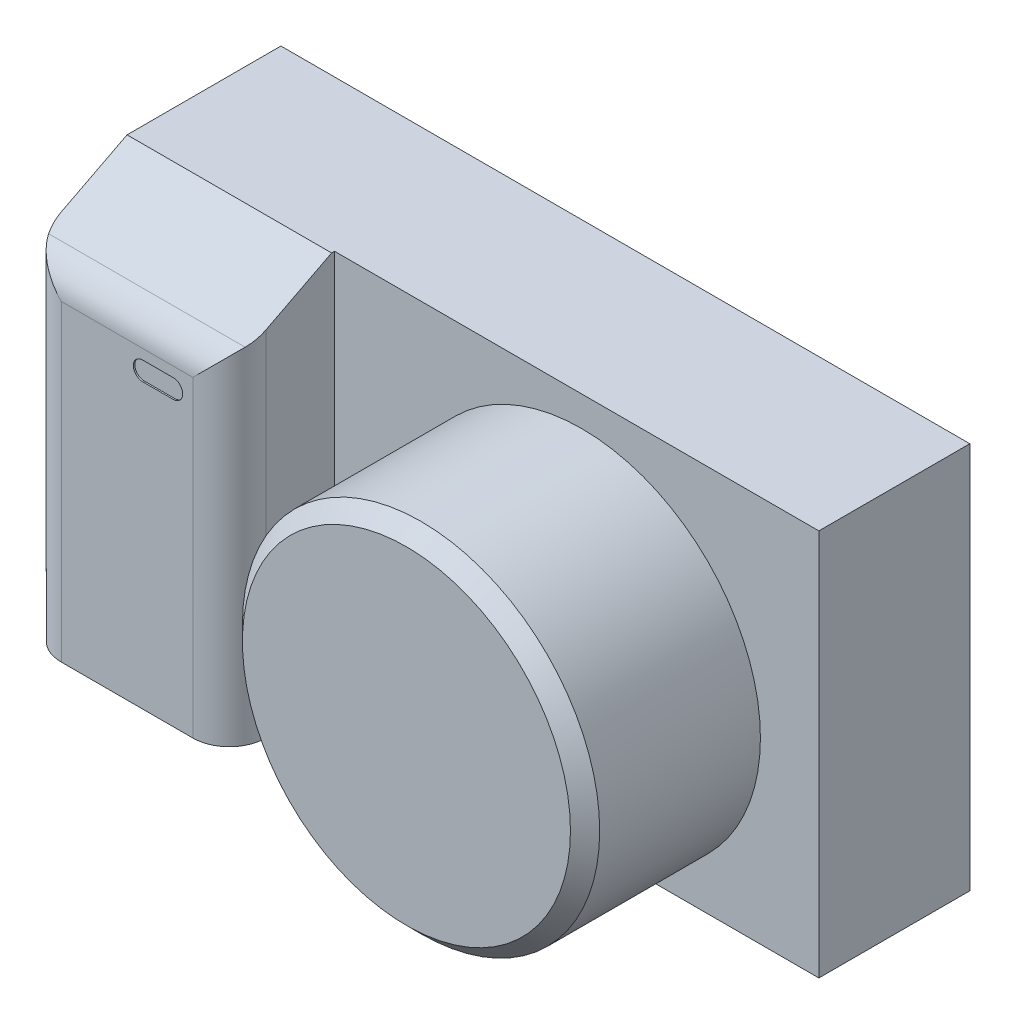
ISO-10303-21;
HEADER;
FILE_DESCRIPTION(('STEP AP214'),'2;1');
FILE_NAME('part.step','',(''),(''),'','','');
FILE_SCHEMA(('AUTOMOTIVE_DESIGN { 1 0 10303 214 1 1 1 1 }'));
ENDSEC;
DATA;
#1=APPLICATION_CONTEXT('core data for automotive mechanical design processes');
#2=APPLICATION_PROTOCOL_DEFINITION('international standard','automotive_design',2000,#1);
#3=PRODUCT_CONTEXT('',#1,'mechanical');
#4=PRODUCT('Part','Part','',(#3));
#5=PRODUCT_RELATED_PRODUCT_CATEGORY('part','',(#4));
#6=PRODUCT_DEFINITION_FORMATION('','',#4);
#7=PRODUCT_DEFINITION_CONTEXT('part definition',#1,'design');
#8=PRODUCT_DEFINITION('design','',#6,#7);
#9=PRODUCT_DEFINITION_SHAPE('','',#8);
#10=(LENGTH_UNIT() NAMED_UNIT(*) SI_UNIT(.MILLI.,.METRE.));
#11=(NAMED_UNIT(*) PLANE_ANGLE_UNIT() SI_UNIT($,.RADIAN.));
#12=(NAMED_UNIT(*) SI_UNIT($,.STERADIAN.) SOLID_ANGLE_UNIT());
#13=UNCERTAINTY_MEASURE_WITH_UNIT(LENGTH_MEASURE(1.E-05),#10,'distance_accuracy_value','');
#14=(GEOMETRIC_REPRESENTATION_CONTEXT(3) GLOBAL_UNCERTAINTY_ASSIGNED_CONTEXT((#13)) GLOBAL_UNIT_ASSIGNED_CONTEXT((#10,
#11,#12)) REPRESENTATION_CONTEXT('',''));
#15=CARTESIAN_POINT('',(0.,0.,0.));
#16=DIRECTION('',(0.,0.,1.));
#17=DIRECTION('',(1.,0.,0.));
#18=AXIS2_PLACEMENT_3D('',#15,#16,#17);
#19=CARTESIAN_POINT('',(0.,0.,26.2382));
#20=DIRECTION('',(0.,0.,-1.));
#21=DIRECTION('',(-1.,0.,0.));
#22=AXIS2_PLACEMENT_3D('',#19,#20,#21);
#23=PLANE('',#22);
#24=DIRECTION('',(0.,1.,0.));
#25=VECTOR('',#24,1.);
#26=CARTESIAN_POINT('',(-24.31415,33.655,26.2382));
#27=LINE('',#26,#25);
#28=CARTESIAN_POINT('',(-24.31415,-33.655,26.2382));
#29=VERTEX_POINT('',#28);
#30=CARTESIAN_POINT('',(-24.31415,33.655,26.2382));
#31=VERTEX_POINT('',#30);
#32=EDGE_CURVE('E195',#29,#31,#27,.T.);
#33=ORIENTED_EDGE('',*,*,#32,.F.);
#34=DIRECTION('',(1.,0.,0.));
#35=VECTOR('',#34,1.);
#36=CARTESIAN_POINT('',(-59.87415,-33.655,26.2382));
#37=LINE('',#36,#35);
#38=CARTESIAN_POINT('',(18.66265,-33.655,26.2382));
#39=VERTEX_POINT('',#38);
#40=EDGE_CURVE('E213',#29,#39,#37,.T.);
#41=ORIENTED_EDGE('',*,*,#40,.T.);
#42=CARTESIAN_POINT('',(18.66265,-2.6035,26.2382));
#43=DIRECTION('',(0.,0.,1.));
#44=DIRECTION('',(1.,0.,0.));
#45=AXIS2_PLACEMENT_3D('',#42,#43,#44);
#46=CIRCLE('',#45,31.0515);
#47=EDGE_CURVE('E201',#39,#39,#46,.T.);
#48=ORIENTED_EDGE('',*,*,#47,.F.);
#49=CARTESIAN_POINT('',(59.87415,-33.655,26.2382));
#50=VERTEX_POINT('',#49);
#51=EDGE_CURVE('E212',#39,#50,#37,.T.);
#52=ORIENTED_EDGE('',*,*,#51,.T.);
#53=DIRECTION('',(0.,1.,0.));
#54=VECTOR('',#53,1.);
#55=CARTESIAN_POINT('',(59.87415,-33.655,26.2382));
#56=LINE('',#55,#54);
#57=CARTESIAN_POINT('',(59.87415,33.655,26.2382));
#58=VERTEX_POINT('',#57);
#59=EDGE_CURVE('E205',#50,#58,#56,.T.);
#60=ORIENTED_EDGE('',*,*,#59,.T.);
#61=DIRECTION('',(-1.,0.,0.));
#62=VECTOR('',#61,1.);
#63=CARTESIAN_POINT('',(-59.87415,33.655,26.2382));
#64=LINE('',#63,#62);
#65=EDGE_CURVE('E208',#58,#31,#64,.T.);
#66=ORIENTED_EDGE('',*,*,#65,.T.);
#67=EDGE_LOOP('',(#33,#41,#48,#52,#60,#66));
#68=FACE_BOUND('',#67,.T.);
#69=ADVANCED_FACE('F39',(#68),#23,.F.);
#70=CARTESIAN_POINT('',(59.87415,-33.655,26.2382));
#71=DIRECTION('',(-1.,0.,0.));
#72=DIRECTION('',(0.,0.,1.));
#73=AXIS2_PLACEMENT_3D('',#70,#71,#72);
#74=PLANE('',#73);
#75=DIRECTION('',(0.,1.,0.));
#76=VECTOR('',#75,1.);
#77=CARTESIAN_POINT('',(59.87415,-33.655,0.));
#78=LINE('',#77,#76);
#79=CARTESIAN_POINT('',(59.87415,-33.655,0.));
#80=VERTEX_POINT('',#79);
#81=CARTESIAN_POINT('',(59.87415,33.655,0.));
#82=VERTEX_POINT('',#81);
#83=EDGE_CURVE('E204',#80,#82,#78,.T.);
#84=ORIENTED_EDGE('',*,*,#83,.T.);
#85=DIRECTION('',(0.,0.,-1.));
#86=VECTOR('',#85,1.);
#87=CARTESIAN_POINT('',(59.87415,33.655,26.2382));
#88=LINE('',#87,#86);
#89=EDGE_CURVE('E231',#58,#82,#88,.T.);
#90=ORIENTED_EDGE('',*,*,#89,.F.);
#91=ORIENTED_EDGE('',*,*,#59,.F.);
#92=DIRECTION('',(0.,0.,-1.));
#93=VECTOR('',#92,1.);
#94=CARTESIAN_POINT('',(59.87415,-33.655,26.2382));
#95=LINE('',#94,#93);
#96=EDGE_CURVE('E215',#50,#80,#95,.T.);
#97=ORIENTED_EDGE('',*,*,#96,.T.);
#98=EDGE_LOOP('',(#84,#90,#91,#97));
#99=FACE_BOUND('',#98,.T.);
#100=ADVANCED_FACE('F295',(#99),#74,.F.);
#101=CARTESIAN_POINT('',(-59.87415,33.655,26.2382));
#102=DIRECTION('',(0.,-1.,0.));
#103=DIRECTION('',(0.,0.,-1.));
#104=AXIS2_PLACEMENT_3D('',#101,#102,#103);
#105=PLANE('',#104);
#106=DIRECTION('',(0.,0.,-1.));
#107=VECTOR('',#106,1.);
#108=CARTESIAN_POINT('',(-59.87415,33.655,26.2382));
#109=LINE('',#108,#107);
#110=CARTESIAN_POINT('',(-59.87415,33.655,26.7461999999999));
#111=VERTEX_POINT('',#110);
#112=CARTESIAN_POINT('',(-59.87415,33.655,0.));
#113=VERTEX_POINT('',#112);
#114=EDGE_CURVE('E229',#111,#113,#109,.T.);
#115=ORIENTED_EDGE('',*,*,#114,.F.);
#116=DIRECTION('',(1.,0.,0.));
#117=VECTOR('',#116,1.);
#118=CARTESIAN_POINT('',(-24.31415,33.655,26.7461999999999));
#119=LINE('',#118,#117);
#120=CARTESIAN_POINT('',(-24.31415,33.655,26.7461999999999));
#121=VERTEX_POINT('',#120);
#122=EDGE_CURVE('E242',#111,#121,#119,.T.);
#123=ORIENTED_EDGE('',*,*,#122,.T.);
#124=DIRECTION('',(0.,0.,-1.));
#125=VECTOR('',#124,1.);
#126=CARTESIAN_POINT('',(-24.31415,33.655,44.5262));
#127=LINE('',#126,#125);
#128=EDGE_CURVE('E194',#121,#31,#127,.T.);
#129=ORIENTED_EDGE('',*,*,#128,.T.);
#130=ORIENTED_EDGE('',*,*,#65,.F.);
#131=ORIENTED_EDGE('',*,*,#89,.T.);
#132=DIRECTION('',(-1.,0.,0.));
#133=VECTOR('',#132,1.);
#134=CARTESIAN_POINT('',(-59.87415,33.655,0.));
#135=LINE('',#134,#133);
#136=EDGE_CURVE('E218',#82,#113,#135,.T.);
#137=ORIENTED_EDGE('',*,*,#136,.T.);
#138=EDGE_LOOP('',(#115,#123,#129,#130,#131,#137));
#139=FACE_BOUND('',#138,.T.);
#140=ADVANCED_FACE('F287',(#139),#105,.F.);
#141=CARTESIAN_POINT('',(-59.87415,-33.655,26.2382));
#142=DIRECTION('',(1.,0.,0.));
#143=DIRECTION('',(0.,0.,-1.));
#144=AXIS2_PLACEMENT_3D('',#141,#142,#143);
#145=PLANE('',#144);
#146=DIRECTION('',(0.,0.,-1.));
#147=VECTOR('',#146,1.);
#148=CARTESIAN_POINT('',(-59.87415,-33.655,26.2382));
#149=LINE('',#148,#147);
#150=CARTESIAN_POINT('',(-59.87415,-33.655,38.1762));
#151=VERTEX_POINT('',#150);
#152=CARTESIAN_POINT('',(-59.87415,-33.655,0.));
#153=VERTEX_POINT('',#152);
#154=EDGE_CURVE('E227',#151,#153,#149,.T.);
#155=ORIENTED_EDGE('',*,*,#154,.F.);
#156=DIRECTION('',(0.,-1.,0.));
#157=VECTOR('',#156,1.);
#158=CARTESIAN_POINT('',(-59.87415,24.511,38.1762));
#159=LINE('',#158,#157);
#160=CARTESIAN_POINT('',(-59.87415,27.7767142857143,38.1762));
#161=VERTEX_POINT('',#160);
#162=EDGE_CURVE('E11',#151,#161,#159,.F.);
#163=ORIENTED_EDGE('',*,*,#162,.T.);
#164=DIRECTION('',(0.,0.45734801262076,-0.889287802318148));
#165=VECTOR('',#164,1.);
#166=CARTESIAN_POINT('',(-59.87415,24.511,44.5262));
#167=LINE('',#166,#165);
#168=EDGE_CURVE('E240',#161,#111,#167,.T.);
#169=ORIENTED_EDGE('',*,*,#168,.T.);
#170=ORIENTED_EDGE('',*,*,#114,.T.);
#171=DIRECTION('',(0.,-1.,0.));
#172=VECTOR('',#171,1.);
#173=CARTESIAN_POINT('',(-59.87415,-33.655,0.));
#174=LINE('',#173,#172);
#175=EDGE_CURVE('E221',#113,#153,#174,.T.);
#176=ORIENTED_EDGE('',*,*,#175,.T.);
#177=EDGE_LOOP('',(#155,#163,#169,#170,#176));
#178=FACE_BOUND('',#177,.T.);
#179=ADVANCED_FACE('F302',(#178),#145,.F.);
#180=CARTESIAN_POINT('',(-59.87415,-33.655,26.2382));
#181=DIRECTION('',(0.,1.,0.));
#182=DIRECTION('',(0.,0.,1.));
#183=AXIS2_PLACEMENT_3D('',#180,#181,#182);
#184=PLANE('',#183);
#185=CARTESIAN_POINT('',(19.74215,-33.655,13.462));
#186=DIRECTION('',(0.,-1.,0.));
#187=DIRECTION('',(0.,0.,-1.));
#188=AXIS2_PLACEMENT_3D('',#185,#186,#187);
#189=CIRCLE('',#188,2.5527);
#190=CARTESIAN_POINT('',(19.74215,-33.655,10.9093));
#191=VERTEX_POINT('',#190);
#192=EDGE_CURVE('E156',#191,#191,#189,.T.);
#193=ORIENTED_EDGE('',*,*,#192,.F.);
#194=EDGE_LOOP('',(#193));
#195=FACE_BOUND('',#194,.T.);
#196=DIRECTION('',(0.,0.,-1.));
#197=VECTOR('',#196,1.);
#198=CARTESIAN_POINT('',(-24.31415,-33.655,44.5262));
#199=LINE('',#198,#197);
#200=CARTESIAN_POINT('',(-24.31415,-33.655,38.1762));
#201=VERTEX_POINT('',#200);
#202=EDGE_CURVE('E199',#201,#29,#199,.T.);
#203=ORIENTED_EDGE('',*,*,#202,.F.);
#204=CARTESIAN_POINT('',(-30.66415,-33.655,38.1762));
#205=DIRECTION('',(0.,1.,0.));
#206=DIRECTION('',(0.,0.,1.));
#207=AXIS2_PLACEMENT_3D('',#204,#205,#206);
#208=CIRCLE('',#207,6.35);
#209=CARTESIAN_POINT('',(-30.66415,-33.655,44.5262));
#210=VERTEX_POINT('',#209);
#211=EDGE_CURVE('E48',#201,#210,#208,.F.);
#212=ORIENTED_EDGE('',*,*,#211,.T.);
#213=DIRECTION('',(1.,0.,0.));
#214=VECTOR('',#213,1.);
#215=CARTESIAN_POINT('',(-59.87415,-33.655,44.5262));
#216=LINE('',#215,#214);
#217=CARTESIAN_POINT('',(-53.52415,-33.655,44.5262));
#218=VERTEX_POINT('',#217);
#219=EDGE_CURVE('E191',#218,#210,#216,.T.);
#220=ORIENTED_EDGE('',*,*,#219,.F.);
#221=CARTESIAN_POINT('',(-53.52415,-33.655,38.1762));
#222=DIRECTION('',(0.,1.,0.));
#223=DIRECTION('',(0.,0.,1.));
#224=AXIS2_PLACEMENT_3D('',#221,#222,#223);
#225=CIRCLE('',#224,6.35);
#226=EDGE_CURVE('E64',#218,#151,#225,.F.);
#227=ORIENTED_EDGE('',*,*,#226,.T.);
#228=ORIENTED_EDGE('',*,*,#154,.T.);
#229=DIRECTION('',(1.,0.,0.));
#230=VECTOR('',#229,1.);
#231=CARTESIAN_POINT('',(-59.87415,-33.655,0.));
#232=LINE('',#231,#230);
#233=EDGE_CURVE('E209',#153,#80,#232,.T.);
#234=ORIENTED_EDGE('',*,*,#233,.T.);
#235=ORIENTED_EDGE('',*,*,#96,.F.);
#236=ORIENTED_EDGE('',*,*,#51,.F.);
#237=ORIENTED_EDGE('',*,*,#40,.F.);
#238=EDGE_LOOP('',(#203,#212,#220,#227,#228,#234,#235,#236,#237));
#239=FACE_BOUND('',#238,.T.);
#240=ADVANCED_FACE('F310',(#195,#239),#184,.F.);
#241=CARTESIAN_POINT('',(0.,0.,0.));
#242=DIRECTION('',(0.,0.,-1.));
#243=DIRECTION('',(-1.,0.,0.));
#244=AXIS2_PLACEMENT_3D('',#241,#242,#243);
#245=PLANE('',#244);
#246=ORIENTED_EDGE('',*,*,#83,.F.);
#247=ORIENTED_EDGE('',*,*,#233,.F.);
#248=ORIENTED_EDGE('',*,*,#175,.F.);
#249=ORIENTED_EDGE('',*,*,#136,.F.);
#250=EDGE_LOOP('',(#246,#247,#248,#249));
#251=FACE_BOUND('',#250,.T.);
#252=ADVANCED_FACE('F300',(#251),#245,.T.);
#253=CARTESIAN_POINT('',(18.66265,-2.6035,56.7182));
#254=DIRECTION('',(0.,0.,-1.));
#255=DIRECTION('',(-1.,0.,0.));
#256=AXIS2_PLACEMENT_3D('',#253,#254,#255);
#257=CYLINDRICAL_SURFACE('',#256,31.0515);
#258=CARTESIAN_POINT('',(18.66265,-2.6035,54.1782));
#259=DIRECTION('',(0.,0.,1.));
#260=DIRECTION('',(1.,0.,0.));
#261=AXIS2_PLACEMENT_3D('',#258,#259,#260);
#262=CIRCLE('',#261,31.0515);
#263=CARTESIAN_POINT('',(49.71415,-2.6035,54.1782));
#264=VERTEX_POINT('',#263);
#265=EDGE_CURVE('E237',#264,#264,#262,.F.);
#266=ORIENTED_EDGE('',*,*,#265,.T.);
#267=EDGE_LOOP('',(#266));
#268=FACE_BOUND('',#267,.T.);
#269=ORIENTED_EDGE('',*,*,#47,.T.);
#270=EDGE_LOOP('',(#269));
#271=FACE_BOUND('',#270,.T.);
#272=ADVANCED_FACE('F313',(#268,#271),#257,.T.);
#273=CARTESIAN_POINT('',(18.66265,-2.6035,56.7182));
#274=DIRECTION('',(0.,0.,1.));
#275=DIRECTION('',(1.,0.,0.));
#276=AXIS2_PLACEMENT_3D('',#273,#274,#275);
#277=PLANE('',#276);
#278=CARTESIAN_POINT('',(18.66265,-2.6035,56.7182));
#279=DIRECTION('',(0.,0.,1.));
#280=DIRECTION('',(1.,0.,0.));
#281=AXIS2_PLACEMENT_3D('',#278,#279,#280);
#282=CIRCLE('',#281,28.5115);
#283=CARTESIAN_POINT('',(47.17415,-2.6035,56.7182));
#284=VERTEX_POINT('',#283);
#285=EDGE_CURVE('E234',#284,#284,#282,.T.);
#286=ORIENTED_EDGE('',*,*,#285,.T.);
#287=EDGE_LOOP('',(#286));
#288=FACE_BOUND('',#287,.T.);
#289=ADVANCED_FACE('F315',(#288),#277,.T.);
#290=CARTESIAN_POINT('',(18.66265,-2.6035,56.7182));
#291=DIRECTION('',(0.,0.,-1.));
#292=DIRECTION('',(-1.,0.,0.));
#293=AXIS2_PLACEMENT_3D('',#290,#291,#292);
#294=CONICAL_SURFACE('',#293,28.5115,0.785398163397446);
#295=ORIENTED_EDGE('',*,*,#265,.F.);
#296=EDGE_LOOP('',(#295));
#297=FACE_BOUND('',#296,.T.);
#298=ORIENTED_EDGE('',*,*,#285,.F.);
#299=EDGE_LOOP('',(#298));
#300=FACE_BOUND('',#299,.T.);
#301=ADVANCED_FACE('F322',(#297,#300),#294,.T.);
#302=CARTESIAN_POINT('',(-24.31415,33.655,44.5262));
#303=DIRECTION('',(-1.,0.,0.));
#304=DIRECTION('',(0.,0.,1.));
#305=AXIS2_PLACEMENT_3D('',#302,#303,#304);
#306=PLANE('',#305);
#307=DIRECTION('',(0.,-0.45734801262076,0.889287802318148));
#308=VECTOR('',#307,1.);
#309=CARTESIAN_POINT('',(-24.31415,24.511,44.5262));
#310=LINE('',#309,#308);
#311=CARTESIAN_POINT('',(-24.31415,27.7767142857143,38.1762));
#312=VERTEX_POINT('',#311);
#313=EDGE_CURVE('E244',#121,#312,#310,.T.);
#314=ORIENTED_EDGE('',*,*,#313,.T.);
#315=DIRECTION('',(0.,1.,0.));
#316=VECTOR('',#315,1.);
#317=CARTESIAN_POINT('',(-24.31415,-33.655,38.1762));
#318=LINE('',#317,#316);
#319=EDGE_CURVE('E260',#312,#201,#318,.F.);
#320=ORIENTED_EDGE('',*,*,#319,.T.);
#321=ORIENTED_EDGE('',*,*,#202,.T.);
#322=ORIENTED_EDGE('',*,*,#32,.T.);
#323=ORIENTED_EDGE('',*,*,#128,.F.);
#324=EDGE_LOOP('',(#314,#320,#321,#322,#323));
#325=FACE_BOUND('',#324,.T.);
#326=ADVANCED_FACE('F282',(#325),#306,.F.);
#327=CARTESIAN_POINT('',(0.,0.,44.5262));
#328=DIRECTION('',(0.,0.,1.));
#329=DIRECTION('',(1.,0.,0.));
#330=AXIS2_PLACEMENT_3D('',#327,#328,#329);
#331=PLANE('',#330);
#332=DIRECTION('',(1.,0.,0.));
#333=VECTOR('',#332,1.);
#334=CARTESIAN_POINT('',(-39.36365,15.621,44.5262));
#335=LINE('',#334,#333);
#336=CARTESIAN_POINT('',(-39.36365,15.621,44.5262));
#337=VERTEX_POINT('',#336);
#338=CARTESIAN_POINT('',(-34.0630363754585,15.621,44.5262));
#339=VERTEX_POINT('',#338);
#340=EDGE_CURVE('E56',#337,#339,#335,.T.);
#341=ORIENTED_EDGE('',*,*,#340,.F.);
#342=CARTESIAN_POINT('',(-39.36365,17.2569355942797,44.5262));
#343=DIRECTION('',(0.,0.,1.));
#344=DIRECTION('',(1.,0.,0.));
#345=AXIS2_PLACEMENT_3D('',#342,#343,#344);
#346=CIRCLE('',#345,1.63593559427966);
#347=CARTESIAN_POINT('',(-39.36365,18.8928711885593,44.5262));
#348=VERTEX_POINT('',#347);
#349=EDGE_CURVE('E167',#348,#337,#346,.T.);
#350=ORIENTED_EDGE('',*,*,#349,.F.);
#351=DIRECTION('',(1.,0.,0.));
#352=VECTOR('',#351,1.);
#353=CARTESIAN_POINT('',(-39.36365,18.8928711885593,44.5262));
#354=LINE('',#353,#352);
#355=CARTESIAN_POINT('',(-34.0630363754585,18.8928711885593,44.5262));
#356=VERTEX_POINT('',#355);
#357=EDGE_CURVE('E178',#348,#356,#354,.T.);
#358=ORIENTED_EDGE('',*,*,#357,.T.);
#359=CARTESIAN_POINT('',(-34.0630363754585,17.2569355942797,44.5262));
#360=DIRECTION('',(0.,0.,1.));
#361=DIRECTION('',(1.,0.,0.));
#362=AXIS2_PLACEMENT_3D('',#359,#360,#361);
#363=CIRCLE('',#362,1.63593559427966);
#364=EDGE_CURVE('E158',#339,#356,#363,.T.);
#365=ORIENTED_EDGE('',*,*,#364,.F.);
#366=EDGE_LOOP('',(#341,#350,#358,#365));
#367=FACE_BOUND('',#366,.T.);
#368=ORIENTED_EDGE('',*,*,#219,.T.);
#369=DIRECTION('',(0.,1.,0.));
#370=VECTOR('',#369,1.);
#371=CARTESIAN_POINT('',(-30.66415,24.511,44.5262));
#372=LINE('',#371,#370);
#373=CARTESIAN_POINT('',(-30.66415,20.6361688026354,44.5262));
#374=VERTEX_POINT('',#373);
#375=EDGE_CURVE('E252',#210,#374,#372,.T.);
#376=ORIENTED_EDGE('',*,*,#375,.T.);
#377=DIRECTION('',(-1.,0.,0.));
#378=VECTOR('',#377,1.);
#379=CARTESIAN_POINT('',(0.,20.6361688026354,44.5262));
#380=LINE('',#379,#378);
#381=CARTESIAN_POINT('',(-53.52415,20.6361688026354,44.5262));
#382=VERTEX_POINT('',#381);
#383=EDGE_CURVE('E249',#374,#382,#380,.T.);
#384=ORIENTED_EDGE('',*,*,#383,.T.);
#385=DIRECTION('',(0.,-1.,0.));
#386=VECTOR('',#385,1.);
#387=CARTESIAN_POINT('',(-53.52415,-33.655,44.5262));
#388=LINE('',#387,#386);
#389=EDGE_CURVE('E247',#382,#218,#388,.T.);
#390=ORIENTED_EDGE('',*,*,#389,.T.);
#391=EDGE_LOOP('',(#368,#376,#384,#390));
#392=FACE_BOUND('',#391,.T.);
#393=ADVANCED_FACE('F309',(#367,#392),#331,.T.);
#394=CARTESIAN_POINT('',(0.,24.511,44.5262));
#395=DIRECTION('',(0.,0.889287802318148,0.45734801262076));
#396=DIRECTION('',(1.,0.,0.));
#397=AXIS2_PLACEMENT_3D('',#394,#395,#396);
#398=PLANE('',#397);
#399=DIRECTION('',(-1.,0.,0.));
#400=VECTOR('',#399,1.);
#401=CARTESIAN_POINT('',(0.,26.2831463473556,41.0803598801418));
#402=LINE('',#401,#400);
#403=CARTESIAN_POINT('',(-59.1711275447203,26.2831463473556,41.0803598801418));
#404=VERTEX_POINT('',#403);
#405=CARTESIAN_POINT('',(-25.0171724552798,26.2831463473556,41.0803598801418));
#406=VERTEX_POINT('',#405);
#407=EDGE_CURVE('E256',#404,#406,#402,.F.);
#408=ORIENTED_EDGE('',*,*,#407,.T.);
#409=CARTESIAN_POINT('',(-30.66415,27.7767142857143,38.1762));
#410=DIRECTION('',(0.,0.889287802318148,0.45734801262076));
#411=DIRECTION('',(0.,-0.45734801262076,0.889287802318148));
#412=AXIS2_PLACEMENT_3D('',#409,#410,#411);
#413=ELLIPSE('',#412,7.14054548307889,6.35);
#414=EDGE_CURVE('E258',#406,#312,#413,.T.);
#415=ORIENTED_EDGE('',*,*,#414,.T.);
#416=ORIENTED_EDGE('',*,*,#313,.F.);
#417=ORIENTED_EDGE('',*,*,#122,.F.);
#418=ORIENTED_EDGE('',*,*,#168,.F.);
#419=CARTESIAN_POINT('',(-53.52415,27.7767142857143,38.1762));
#420=DIRECTION('',(0.,0.889287802318148,0.45734801262076));
#421=DIRECTION('',(0.,0.45734801262076,-0.889287802318148));
#422=AXIS2_PLACEMENT_3D('',#419,#420,#421);
#423=ELLIPSE('',#422,7.14054548307889,6.35);
#424=EDGE_CURVE('E254',#161,#404,#423,.T.);
#425=ORIENTED_EDGE('',*,*,#424,.T.);
#426=EDGE_LOOP('',(#408,#415,#416,#417,#418,#425));
#427=FACE_BOUND('',#426,.T.);
#428=ADVANCED_FACE('F278',(#427),#398,.T.);
#429=CARTESIAN_POINT('',(-30.66415,0.,38.1762));
#430=DIRECTION('',(0.,-1.,0.));
#431=DIRECTION('',(0.,0.,-1.));
#432=AXIS2_PLACEMENT_3D('',#429,#430,#431);
#433=CYLINDRICAL_SURFACE('',#432,6.35);
#434=ORIENTED_EDGE('',*,*,#319,.F.);
#435=ORIENTED_EDGE('',*,*,#414,.F.);
#436=CARTESIAN_POINT('',(-30.66415,20.6361688026354,38.1762));
#437=DIRECTION('',(0.707106781186547,-0.707106781186548,0.));
#438=DIRECTION('',(-0.707106781186547,-0.707106781186548,0.));
#439=AXIS2_PLACEMENT_3D('',#436,#437,#438);
#440=ELLIPSE('',#439,8.98025612106915,6.35);
#441=EDGE_CURVE('E43',#374,#406,#440,.F.);
#442=ORIENTED_EDGE('',*,*,#441,.F.);
#443=ORIENTED_EDGE('',*,*,#375,.F.);
#444=ORIENTED_EDGE('',*,*,#211,.F.);
#445=EDGE_LOOP('',(#434,#435,#442,#443,#444));
#446=FACE_BOUND('',#445,.T.);
#447=ADVANCED_FACE('F41',(#446),#433,.T.);
#448=CARTESIAN_POINT('',(-53.52415,0.,38.1762));
#449=DIRECTION('',(0.,1.,0.));
#450=DIRECTION('',(0.,0.,1.));
#451=AXIS2_PLACEMENT_3D('',#448,#449,#450);
#452=CYLINDRICAL_SURFACE('',#451,6.35);
#453=ORIENTED_EDGE('',*,*,#226,.F.);
#454=ORIENTED_EDGE('',*,*,#389,.F.);
#455=CARTESIAN_POINT('',(-53.52415,20.6361688026354,38.1762));
#456=DIRECTION('',(0.707106781186547,0.707106781186548,0.));
#457=DIRECTION('',(-0.707106781186547,0.707106781186548,0.));
#458=AXIS2_PLACEMENT_3D('',#455,#456,#457);
#459=ELLIPSE('',#458,8.98025612106915,6.35);
#460=EDGE_CURVE('E185',#404,#382,#459,.T.);
#461=ORIENTED_EDGE('',*,*,#460,.F.);
#462=ORIENTED_EDGE('',*,*,#424,.F.);
#463=ORIENTED_EDGE('',*,*,#162,.F.);
#464=EDGE_LOOP('',(#453,#454,#461,#462,#463));
#465=FACE_BOUND('',#464,.T.);
#466=ADVANCED_FACE('F307',(#465),#452,.T.);
#467=CARTESIAN_POINT('',(0.,20.6361688026354,38.1762));
#468=DIRECTION('',(-1.,0.,0.));
#469=DIRECTION('',(0.,0.,1.));
#470=AXIS2_PLACEMENT_3D('',#467,#468,#469);
#471=CYLINDRICAL_SURFACE('',#470,6.35);
#472=ORIENTED_EDGE('',*,*,#441,.T.);
#473=ORIENTED_EDGE('',*,*,#407,.F.);
#474=ORIENTED_EDGE('',*,*,#460,.T.);
#475=ORIENTED_EDGE('',*,*,#383,.F.);
#476=EDGE_LOOP('',(#472,#473,#474,#475));
#477=FACE_BOUND('',#476,.T.);
#478=ADVANCED_FACE('F270',(#477),#471,.T.);
#479=CARTESIAN_POINT('',(-39.36365,15.621,44.2722));
#480=DIRECTION('',(0.,-1.,0.));
#481=DIRECTION('',(0.,0.,-1.));
#482=AXIS2_PLACEMENT_3D('',#479,#480,#481);
#483=PLANE('',#482);
#484=ORIENTED_EDGE('',*,*,#340,.T.);
#485=DIRECTION('',(0.,0.,1.));
#486=VECTOR('',#485,1.);
#487=CARTESIAN_POINT('',(-34.0630363754585,15.621,44.2722));
#488=LINE('',#487,#486);
#489=CARTESIAN_POINT('',(-34.0630363754585,15.621,44.2722));
#490=VERTEX_POINT('',#489);
#491=EDGE_CURVE('E174',#490,#339,#488,.T.);
#492=ORIENTED_EDGE('',*,*,#491,.F.);
#493=DIRECTION('',(1.,0.,0.));
#494=VECTOR('',#493,1.);
#495=CARTESIAN_POINT('',(-39.36365,15.621,44.2722));
#496=LINE('',#495,#494);
#497=CARTESIAN_POINT('',(-39.36365,15.621,44.2722));
#498=VERTEX_POINT('',#497);
#499=EDGE_CURVE('E163',#498,#490,#496,.T.);
#500=ORIENTED_EDGE('',*,*,#499,.F.);
#501=DIRECTION('',(0.,0.,1.));
#502=VECTOR('',#501,1.);
#503=CARTESIAN_POINT('',(-39.36365,15.621,44.2722));
#504=LINE('',#503,#502);
#505=EDGE_CURVE('E183',#498,#337,#504,.T.);
#506=ORIENTED_EDGE('',*,*,#505,.T.);
#507=EDGE_LOOP('',(#484,#492,#500,#506));
#508=FACE_BOUND('',#507,.T.);
#509=ADVANCED_FACE('F346',(#508),#483,.F.);
#510=CARTESIAN_POINT('',(-39.36365,17.2569355942797,44.2722));
#511=DIRECTION('',(0.,0.,1.));
#512=DIRECTION('',(1.,0.,0.));
#513=AXIS2_PLACEMENT_3D('',#510,#511,#512);
#514=CYLINDRICAL_SURFACE('',#513,1.63593559427966);
#515=ORIENTED_EDGE('',*,*,#349,.T.);
#516=ORIENTED_EDGE('',*,*,#505,.F.);
#517=CARTESIAN_POINT('',(-39.36365,17.2569355942797,44.2722));
#518=DIRECTION('',(0.,0.,1.));
#519=DIRECTION('',(1.,0.,0.));
#520=AXIS2_PLACEMENT_3D('',#517,#518,#519);
#521=CIRCLE('',#520,1.63593559427966);
#522=CARTESIAN_POINT('',(-39.36365,18.8928711885593,44.2722));
#523=VERTEX_POINT('',#522);
#524=EDGE_CURVE('E172',#523,#498,#521,.T.);
#525=ORIENTED_EDGE('',*,*,#524,.F.);
#526=DIRECTION('',(0.,0.,1.));
#527=VECTOR('',#526,1.);
#528=CARTESIAN_POINT('',(-39.36365,18.8928711885593,44.2722));
#529=LINE('',#528,#527);
#530=EDGE_CURVE('E186',#523,#348,#529,.T.);
#531=ORIENTED_EDGE('',*,*,#530,.T.);
#532=EDGE_LOOP('',(#515,#516,#525,#531));
#533=FACE_BOUND('',#532,.T.);
#534=ADVANCED_FACE('F444',(#533),#514,.F.);
#535=CARTESIAN_POINT('',(-39.36365,18.8928711885593,44.2722));
#536=DIRECTION('',(0.,-1.,0.));
#537=DIRECTION('',(0.,0.,-1.));
#538=AXIS2_PLACEMENT_3D('',#535,#536,#537);
#539=PLANE('',#538);
#540=ORIENTED_EDGE('',*,*,#357,.F.);
#541=ORIENTED_EDGE('',*,*,#530,.F.);
#542=DIRECTION('',(1.,0.,0.));
#543=VECTOR('',#542,1.);
#544=CARTESIAN_POINT('',(-39.36365,18.8928711885593,44.2722));
#545=LINE('',#544,#543);
#546=CARTESIAN_POINT('',(-34.0630363754585,18.8928711885593,44.2722));
#547=VERTEX_POINT('',#546);
#548=EDGE_CURVE('E170',#523,#547,#545,.T.);
#549=ORIENTED_EDGE('',*,*,#548,.T.);
#550=DIRECTION('',(0.,0.,1.));
#551=VECTOR('',#550,1.);
#552=CARTESIAN_POINT('',(-34.0630363754585,18.8928711885593,44.2722));
#553=LINE('',#552,#551);
#554=EDGE_CURVE('E188',#547,#356,#553,.T.);
#555=ORIENTED_EDGE('',*,*,#554,.T.);
#556=EDGE_LOOP('',(#540,#541,#549,#555));
#557=FACE_BOUND('',#556,.T.);
#558=ADVANCED_FACE('F447',(#557),#539,.T.);
#559=CARTESIAN_POINT('',(-34.0630363754585,17.2569355942797,44.2722));
#560=DIRECTION('',(0.,0.,1.));
#561=DIRECTION('',(1.,0.,0.));
#562=AXIS2_PLACEMENT_3D('',#559,#560,#561);
#563=CYLINDRICAL_SURFACE('',#562,1.63593559427966);
#564=ORIENTED_EDGE('',*,*,#364,.T.);
#565=ORIENTED_EDGE('',*,*,#554,.F.);
#566=CARTESIAN_POINT('',(-34.0630363754585,17.2569355942797,44.2722));
#567=DIRECTION('',(0.,0.,1.));
#568=DIRECTION('',(1.,0.,0.));
#569=AXIS2_PLACEMENT_3D('',#566,#567,#568);
#570=CIRCLE('',#569,1.63593559427966);
#571=EDGE_CURVE('E166',#490,#547,#570,.T.);
#572=ORIENTED_EDGE('',*,*,#571,.F.);
#573=ORIENTED_EDGE('',*,*,#491,.T.);
#574=EDGE_LOOP('',(#564,#565,#572,#573));
#575=FACE_BOUND('',#574,.T.);
#576=ADVANCED_FACE('F442',(#575),#563,.F.);
#577=CARTESIAN_POINT('',(-34.0630363754585,17.2569355942797,44.2722));
#578=DIRECTION('',(0.,0.,1.));
#579=DIRECTION('',(1.,0.,0.));
#580=AXIS2_PLACEMENT_3D('',#577,#578,#579);
#581=PLANE('',#580);
#582=ORIENTED_EDGE('',*,*,#499,.T.);
#583=ORIENTED_EDGE('',*,*,#571,.T.);
#584=ORIENTED_EDGE('',*,*,#548,.F.);
#585=ORIENTED_EDGE('',*,*,#524,.T.);
#586=EDGE_LOOP('',(#582,#583,#584,#585));
#587=FACE_BOUND('',#586,.T.);
#588=ADVANCED_FACE('F150',(#587),#581,.T.);
#589=CARTESIAN_POINT('',(19.74215,-17.145,13.462));
#590=DIRECTION('',(0.,-1.,0.));
#591=DIRECTION('',(0.,0.,-1.));
#592=AXIS2_PLACEMENT_3D('',#589,#590,#591);
#593=CONICAL_SURFACE('',#592,2.55269999999999,1.02974425867665);
#594=CARTESIAN_POINT('',(19.74215,-15.6111830978083,13.462));
#595=VERTEX_POINT('',#594);
#596=VERTEX_LOOP('',#595);
#597=FACE_BOUND('',#596,.T.);
#598=CARTESIAN_POINT('',(19.74215,-17.145,13.462));
#599=DIRECTION('',(0.,-1.,0.));
#600=DIRECTION('',(0.,0.,-1.));
#601=AXIS2_PLACEMENT_3D('',#598,#599,#600);
#602=CIRCLE('',#601,2.55269999999999);
#603=CARTESIAN_POINT('',(19.74215,-17.145,10.9093));
#604=VERTEX_POINT('',#603);
#605=EDGE_CURVE('E154',#604,#604,#602,.T.);
#606=ORIENTED_EDGE('',*,*,#605,.T.);
#607=EDGE_LOOP('',(#606));
#608=FACE_BOUND('',#607,.T.);
#609=ADVANCED_FACE('F146',(#597,#608),#593,.F.);
#610=CARTESIAN_POINT('',(19.74215,-33.655,13.462));
#611=DIRECTION('',(0.,-1.,0.));
#612=DIRECTION('',(0.,0.,-1.));
#613=AXIS2_PLACEMENT_3D('',#610,#611,#612);
#614=CYLINDRICAL_SURFACE('',#613,2.5527);
#615=ORIENTED_EDGE('',*,*,#605,.F.);
#616=EDGE_LOOP('',(#615));
#617=FACE_BOUND('',#616,.T.);
#618=ORIENTED_EDGE('',*,*,#192,.T.);
#619=EDGE_LOOP('',(#618));
#620=FACE_BOUND('',#619,.T.);
#621=ADVANCED_FACE('F149',(#617,#620),#614,.F.);
#622=CLOSED_SHELL('',(#69,#100,#140,#179,#240,#252,#272,#289,#301,#326,#393,#428,#447,#466,#478,
#509,#534,#558,#576,#588,#609,#621));
#623=MANIFOLD_SOLID_BREP('B2',#622);
#624=ADVANCED_BREP_SHAPE_REPRESENTATION('',(#18,#623),#14);
#625=SHAPE_DEFINITION_REPRESENTATION(#9,#624);
ENDSEC;
END-ISO-10303-21;
